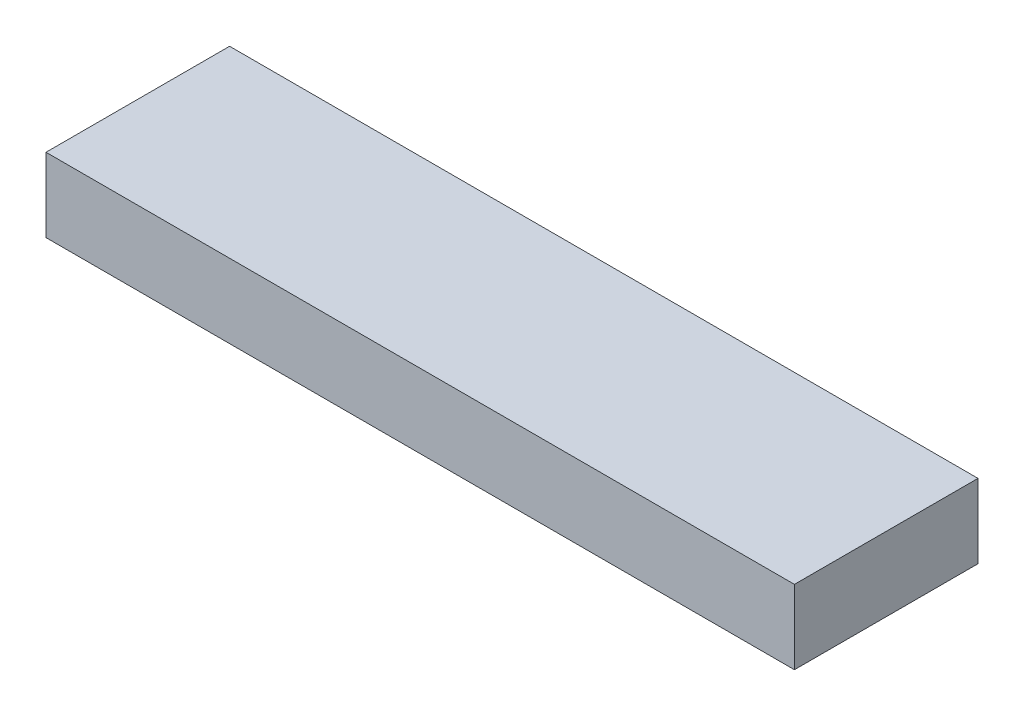
ISO-10303-21;
HEADER;
FILE_DESCRIPTION(('STEP AP214'),'2;1');
FILE_NAME('part.step','',(''),(''),'','','');
FILE_SCHEMA(('AUTOMOTIVE_DESIGN { 1 0 10303 214 1 1 1 1 }'));
ENDSEC;
DATA;
#1=APPLICATION_CONTEXT('core data for automotive mechanical design processes');
#2=APPLICATION_PROTOCOL_DEFINITION('international standard','automotive_design',2000,#1);
#3=PRODUCT_CONTEXT('',#1,'mechanical');
#4=PRODUCT('Part','Part','',(#3));
#5=PRODUCT_RELATED_PRODUCT_CATEGORY('part','',(#4));
#6=PRODUCT_DEFINITION_FORMATION('','',#4);
#7=PRODUCT_DEFINITION_CONTEXT('part definition',#1,'design');
#8=PRODUCT_DEFINITION('design','',#6,#7);
#9=PRODUCT_DEFINITION_SHAPE('','',#8);
#10=(LENGTH_UNIT() NAMED_UNIT(*) SI_UNIT(.MILLI.,.METRE.));
#11=(NAMED_UNIT(*) PLANE_ANGLE_UNIT() SI_UNIT($,.RADIAN.));
#12=(NAMED_UNIT(*) SI_UNIT($,.STERADIAN.) SOLID_ANGLE_UNIT());
#13=UNCERTAINTY_MEASURE_WITH_UNIT(LENGTH_MEASURE(1.E-05),#10,'distance_accuracy_value','');
#14=(GEOMETRIC_REPRESENTATION_CONTEXT(3) GLOBAL_UNCERTAINTY_ASSIGNED_CONTEXT((#13)) GLOBAL_UNIT_ASSIGNED_CONTEXT((#10,
#11,#12)) REPRESENTATION_CONTEXT('',''));
#15=CARTESIAN_POINT('',(0.,0.,0.));
#16=DIRECTION('',(0.,0.,1.));
#17=DIRECTION('',(1.,0.,0.));
#18=AXIS2_PLACEMENT_3D('',#15,#16,#17);
#19=CARTESIAN_POINT('',(15.94,-3.15,-3.91));
#20=DIRECTION('',(1.,0.,0.));
#21=DIRECTION('',(0.,0.,-1.));
#22=AXIS2_PLACEMENT_3D('',#19,#20,#21);
#23=PLANE('',#22);
#24=DIRECTION('',(0.,0.,-1.));
#25=VECTOR('',#24,1.);
#26=CARTESIAN_POINT('',(15.94,0.,-3.91));
#27=LINE('',#26,#25);
#28=CARTESIAN_POINT('',(15.94,0.,3.91));
#29=VERTEX_POINT('',#28);
#30=CARTESIAN_POINT('',(15.94,0.,-3.91));
#31=VERTEX_POINT('',#30);
#32=EDGE_CURVE('E117',#29,#31,#27,.T.);
#33=ORIENTED_EDGE('',*,*,#32,.F.);
#34=DIRECTION('',(0.,1.,0.));
#35=VECTOR('',#34,1.);
#36=CARTESIAN_POINT('',(15.94,-3.15,3.91));
#37=LINE('',#36,#35);
#38=CARTESIAN_POINT('',(15.94,-3.15,3.91));
#39=VERTEX_POINT('',#38);
#40=EDGE_CURVE('E57',#39,#29,#37,.T.);
#41=ORIENTED_EDGE('',*,*,#40,.F.);
#42=DIRECTION('',(0.,0.,-1.));
#43=VECTOR('',#42,1.);
#44=CARTESIAN_POINT('',(15.94,-3.15,-3.91));
#45=LINE('',#44,#43);
#46=CARTESIAN_POINT('',(15.94,-3.15,-3.91));
#47=VERTEX_POINT('',#46);
#48=EDGE_CURVE('E149',#39,#47,#45,.T.);
#49=ORIENTED_EDGE('',*,*,#48,.T.);
#50=DIRECTION('',(0.,1.,0.));
#51=VECTOR('',#50,1.);
#52=CARTESIAN_POINT('',(15.94,-3.15,-3.91));
#53=LINE('',#52,#51);
#54=EDGE_CURVE('E83',#47,#31,#53,.T.);
#55=ORIENTED_EDGE('',*,*,#54,.T.);
#56=EDGE_LOOP('',(#33,#41,#49,#55));
#57=FACE_BOUND('',#56,.T.);
#58=ADVANCED_FACE('F34',(#57),#23,.T.);
#59=CARTESIAN_POINT('',(-15.94,-3.15,3.91));
#60=DIRECTION('',(0.,0.,1.));
#61=DIRECTION('',(1.,0.,0.));
#62=AXIS2_PLACEMENT_3D('',#59,#60,#61);
#63=PLANE('',#62);
#64=DIRECTION('',(1.,0.,0.));
#65=VECTOR('',#64,1.);
#66=CARTESIAN_POINT('',(-15.94,0.,3.91));
#67=LINE('',#66,#65);
#68=CARTESIAN_POINT('',(-15.94,0.,3.91));
#69=VERTEX_POINT('',#68);
#70=EDGE_CURVE('E152',#69,#29,#67,.T.);
#71=ORIENTED_EDGE('',*,*,#70,.F.);
#72=DIRECTION('',(0.,1.,0.));
#73=VECTOR('',#72,1.);
#74=CARTESIAN_POINT('',(-15.94,-3.15,3.91));
#75=LINE('',#74,#73);
#76=CARTESIAN_POINT('',(-15.94,-3.15,3.91));
#77=VERTEX_POINT('',#76);
#78=EDGE_CURVE('E171',#77,#69,#75,.T.);
#79=ORIENTED_EDGE('',*,*,#78,.F.);
#80=DIRECTION('',(1.,0.,0.));
#81=VECTOR('',#80,1.);
#82=CARTESIAN_POINT('',(-15.94,-3.15,3.91));
#83=LINE('',#82,#81);
#84=EDGE_CURVE('E157',#77,#39,#83,.T.);
#85=ORIENTED_EDGE('',*,*,#84,.T.);
#86=ORIENTED_EDGE('',*,*,#40,.T.);
#87=EDGE_LOOP('',(#71,#79,#85,#86));
#88=FACE_BOUND('',#87,.T.);
#89=ADVANCED_FACE('F205',(#88),#63,.T.);
#90=CARTESIAN_POINT('',(-15.94,-3.15,-3.91));
#91=DIRECTION('',(-1.,0.,0.));
#92=DIRECTION('',(0.,0.,1.));
#93=AXIS2_PLACEMENT_3D('',#90,#91,#92);
#94=PLANE('',#93);
#95=DIRECTION('',(0.,0.,1.));
#96=VECTOR('',#95,1.);
#97=CARTESIAN_POINT('',(-15.94,0.,-3.91));
#98=LINE('',#97,#96);
#99=CARTESIAN_POINT('',(-15.94,0.,-3.91));
#100=VERTEX_POINT('',#99);
#101=EDGE_CURVE('E164',#100,#69,#98,.T.);
#102=ORIENTED_EDGE('',*,*,#101,.F.);
#103=DIRECTION('',(0.,1.,0.));
#104=VECTOR('',#103,1.);
#105=CARTESIAN_POINT('',(-15.94,-3.15,-3.91));
#106=LINE('',#105,#104);
#107=CARTESIAN_POINT('',(-15.94,-3.15,-3.91));
#108=VERTEX_POINT('',#107);
#109=EDGE_CURVE('E173',#108,#100,#106,.T.);
#110=ORIENTED_EDGE('',*,*,#109,.F.);
#111=DIRECTION('',(0.,0.,1.));
#112=VECTOR('',#111,1.);
#113=CARTESIAN_POINT('',(-15.94,-3.15,-3.91));
#114=LINE('',#113,#112);
#115=EDGE_CURVE('E154',#108,#77,#114,.T.);
#116=ORIENTED_EDGE('',*,*,#115,.T.);
#117=ORIENTED_EDGE('',*,*,#78,.T.);
#118=EDGE_LOOP('',(#102,#110,#116,#117));
#119=FACE_BOUND('',#118,.T.);
#120=ADVANCED_FACE('F209',(#119),#94,.T.);
#121=CARTESIAN_POINT('',(-15.94,-3.15,-3.91));
#122=DIRECTION('',(0.,0.,-1.));
#123=DIRECTION('',(-1.,0.,0.));
#124=AXIS2_PLACEMENT_3D('',#121,#122,#123);
#125=PLANE('',#124);
#126=DIRECTION('',(-1.,0.,0.));
#127=VECTOR('',#126,1.);
#128=CARTESIAN_POINT('',(-15.94,0.,-3.91));
#129=LINE('',#128,#127);
#130=EDGE_CURVE('E161',#31,#100,#129,.T.);
#131=ORIENTED_EDGE('',*,*,#130,.F.);
#132=ORIENTED_EDGE('',*,*,#54,.F.);
#133=DIRECTION('',(-1.,0.,0.));
#134=VECTOR('',#133,1.);
#135=CARTESIAN_POINT('',(-15.94,-3.15,-3.91));
#136=LINE('',#135,#134);
#137=EDGE_CURVE('E151',#47,#108,#136,.T.);
#138=ORIENTED_EDGE('',*,*,#137,.T.);
#139=ORIENTED_EDGE('',*,*,#109,.T.);
#140=EDGE_LOOP('',(#131,#132,#138,#139));
#141=FACE_BOUND('',#140,.T.);
#142=ADVANCED_FACE('F219',(#141),#125,.T.);
#143=CARTESIAN_POINT('',(0.,-3.15,0.));
#144=DIRECTION('',(0.,1.,0.));
#145=DIRECTION('',(0.,0.,1.));
#146=AXIS2_PLACEMENT_3D('',#143,#144,#145);
#147=PLANE('',#146);
#148=DIRECTION('',(1.,0.,0.));
#149=VECTOR('',#148,1.);
#150=CARTESIAN_POINT('',(0.,-3.15,2.31));
#151=LINE('',#150,#149);
#152=CARTESIAN_POINT('',(-14.34,-3.15,2.31));
#153=VERTEX_POINT('',#152);
#154=CARTESIAN_POINT('',(14.34,-3.15,2.31));
#155=VERTEX_POINT('',#154);
#156=EDGE_CURVE('E144',#153,#155,#151,.T.);
#157=ORIENTED_EDGE('',*,*,#156,.T.);
#158=DIRECTION('',(0.,0.,-1.));
#159=VECTOR('',#158,1.);
#160=CARTESIAN_POINT('',(14.34,-3.15,0.));
#161=LINE('',#160,#159);
#162=CARTESIAN_POINT('',(14.34,-3.15,-2.31));
#163=VERTEX_POINT('',#162);
#164=EDGE_CURVE('E112',#155,#163,#161,.T.);
#165=ORIENTED_EDGE('',*,*,#164,.T.);
#166=DIRECTION('',(-1.,0.,0.));
#167=VECTOR('',#166,1.);
#168=CARTESIAN_POINT('',(0.,-3.15,-2.31));
#169=LINE('',#168,#167);
#170=CARTESIAN_POINT('',(-14.34,-3.15,-2.31));
#171=VERTEX_POINT('',#170);
#172=EDGE_CURVE('E134',#163,#171,#169,.T.);
#173=ORIENTED_EDGE('',*,*,#172,.T.);
#174=DIRECTION('',(0.,0.,1.));
#175=VECTOR('',#174,1.);
#176=CARTESIAN_POINT('',(-14.34,-3.15,0.));
#177=LINE('',#176,#175);
#178=EDGE_CURVE('E48',#171,#153,#177,.T.);
#179=ORIENTED_EDGE('',*,*,#178,.T.);
#180=EDGE_LOOP('',(#157,#165,#173,#179));
#181=FACE_BOUND('',#180,.T.);
#182=ORIENTED_EDGE('',*,*,#48,.F.);
#183=ORIENTED_EDGE('',*,*,#84,.F.);
#184=ORIENTED_EDGE('',*,*,#115,.F.);
#185=ORIENTED_EDGE('',*,*,#137,.F.);
#186=EDGE_LOOP('',(#182,#183,#184,#185));
#187=FACE_BOUND('',#186,.T.);
#188=ADVANCED_FACE('F218',(#181,#187),#147,.F.);
#189=CARTESIAN_POINT('',(0.,0.,0.));
#190=DIRECTION('',(0.,1.,0.));
#191=DIRECTION('',(0.,0.,1.));
#192=AXIS2_PLACEMENT_3D('',#189,#190,#191);
#193=PLANE('',#192);
#194=ORIENTED_EDGE('',*,*,#32,.T.);
#195=ORIENTED_EDGE('',*,*,#130,.T.);
#196=ORIENTED_EDGE('',*,*,#101,.T.);
#197=ORIENTED_EDGE('',*,*,#70,.T.);
#198=EDGE_LOOP('',(#194,#195,#196,#197));
#199=FACE_BOUND('',#198,.T.);
#200=ADVANCED_FACE('F212',(#199),#193,.T.);
#201=CARTESIAN_POINT('',(14.34,-3.15,-3.91));
#202=DIRECTION('',(1.,0.,0.));
#203=DIRECTION('',(0.,0.,-1.));
#204=AXIS2_PLACEMENT_3D('',#201,#202,#203);
#205=PLANE('',#204);
#206=DIRECTION('',(0.,0.,-1.));
#207=VECTOR('',#206,1.);
#208=CARTESIAN_POINT('',(14.34,-1.6,0.));
#209=LINE('',#208,#207);
#210=CARTESIAN_POINT('',(14.34,-1.6,2.31));
#211=VERTEX_POINT('',#210);
#212=CARTESIAN_POINT('',(14.34,-1.6,-2.31));
#213=VERTEX_POINT('',#212);
#214=EDGE_CURVE('E110',#211,#213,#209,.T.);
#215=ORIENTED_EDGE('',*,*,#214,.T.);
#216=DIRECTION('',(0.,1.,0.));
#217=VECTOR('',#216,1.);
#218=CARTESIAN_POINT('',(14.34,-3.15,-2.31));
#219=LINE('',#218,#217);
#220=EDGE_CURVE('E139',#163,#213,#219,.T.);
#221=ORIENTED_EDGE('',*,*,#220,.F.);
#222=ORIENTED_EDGE('',*,*,#164,.F.);
#223=DIRECTION('',(0.,1.,0.));
#224=VECTOR('',#223,1.);
#225=CARTESIAN_POINT('',(14.34,-3.15,2.31));
#226=LINE('',#225,#224);
#227=EDGE_CURVE('E107',#155,#211,#226,.T.);
#228=ORIENTED_EDGE('',*,*,#227,.T.);
#229=EDGE_LOOP('',(#215,#221,#222,#228));
#230=FACE_BOUND('',#229,.T.);
#231=ADVANCED_FACE('F109',(#230),#205,.F.);
#232=CARTESIAN_POINT('',(-15.94,-3.15,2.31));
#233=DIRECTION('',(0.,0.,1.));
#234=DIRECTION('',(1.,0.,0.));
#235=AXIS2_PLACEMENT_3D('',#232,#233,#234);
#236=PLANE('',#235);
#237=DIRECTION('',(1.,0.,0.));
#238=VECTOR('',#237,1.);
#239=CARTESIAN_POINT('',(0.,-1.6,2.31));
#240=LINE('',#239,#238);
#241=CARTESIAN_POINT('',(-14.34,-1.6,2.31));
#242=VERTEX_POINT('',#241);
#243=EDGE_CURVE('E125',#242,#211,#240,.T.);
#244=ORIENTED_EDGE('',*,*,#243,.T.);
#245=ORIENTED_EDGE('',*,*,#227,.F.);
#246=ORIENTED_EDGE('',*,*,#156,.F.);
#247=DIRECTION('',(0.,1.,0.));
#248=VECTOR('',#247,1.);
#249=CARTESIAN_POINT('',(-14.34,-3.15,2.31));
#250=LINE('',#249,#248);
#251=EDGE_CURVE('E118',#153,#242,#250,.T.);
#252=ORIENTED_EDGE('',*,*,#251,.T.);
#253=EDGE_LOOP('',(#244,#245,#246,#252));
#254=FACE_BOUND('',#253,.T.);
#255=ADVANCED_FACE('F130',(#254),#236,.F.);
#256=CARTESIAN_POINT('',(-14.34,-3.15,-3.91));
#257=DIRECTION('',(-1.,0.,0.));
#258=DIRECTION('',(0.,0.,1.));
#259=AXIS2_PLACEMENT_3D('',#256,#257,#258);
#260=PLANE('',#259);
#261=DIRECTION('',(0.,0.,1.));
#262=VECTOR('',#261,1.);
#263=CARTESIAN_POINT('',(-14.34,-1.6,0.));
#264=LINE('',#263,#262);
#265=CARTESIAN_POINT('',(-14.34,-1.6,-2.31));
#266=VERTEX_POINT('',#265);
#267=EDGE_CURVE('E132',#266,#242,#264,.T.);
#268=ORIENTED_EDGE('',*,*,#267,.T.);
#269=ORIENTED_EDGE('',*,*,#251,.F.);
#270=ORIENTED_EDGE('',*,*,#178,.F.);
#271=DIRECTION('',(0.,1.,0.));
#272=VECTOR('',#271,1.);
#273=CARTESIAN_POINT('',(-14.34,-3.15,-2.31));
#274=LINE('',#273,#272);
#275=EDGE_CURVE('E140',#171,#266,#274,.T.);
#276=ORIENTED_EDGE('',*,*,#275,.T.);
#277=EDGE_LOOP('',(#268,#269,#270,#276));
#278=FACE_BOUND('',#277,.T.);
#279=ADVANCED_FACE('F233',(#278),#260,.F.);
#280=CARTESIAN_POINT('',(-15.94,-3.15,-2.31));
#281=DIRECTION('',(0.,0.,-1.));
#282=DIRECTION('',(-1.,0.,0.));
#283=AXIS2_PLACEMENT_3D('',#280,#281,#282);
#284=PLANE('',#283);
#285=DIRECTION('',(-1.,0.,0.));
#286=VECTOR('',#285,1.);
#287=CARTESIAN_POINT('',(0.,-1.6,-2.31));
#288=LINE('',#287,#286);
#289=EDGE_CURVE('E127',#213,#266,#288,.T.);
#290=ORIENTED_EDGE('',*,*,#289,.T.);
#291=ORIENTED_EDGE('',*,*,#275,.F.);
#292=ORIENTED_EDGE('',*,*,#172,.F.);
#293=ORIENTED_EDGE('',*,*,#220,.T.);
#294=EDGE_LOOP('',(#290,#291,#292,#293));
#295=FACE_BOUND('',#294,.T.);
#296=ADVANCED_FACE('F185',(#295),#284,.F.);
#297=CARTESIAN_POINT('',(0.,-1.6,0.));
#298=DIRECTION('',(0.,1.,0.));
#299=DIRECTION('',(0.,0.,1.));
#300=AXIS2_PLACEMENT_3D('',#297,#298,#299);
#301=PLANE('',#300);
#302=CARTESIAN_POINT('',(7.97,-1.6,0.));
#303=DIRECTION('',(0.,1.,0.));
#304=DIRECTION('',(0.,0.,1.));
#305=AXIS2_PLACEMENT_3D('',#302,#303,#304);
#306=CIRCLE('',#305,1.475);
#307=CARTESIAN_POINT('',(7.97,-1.6,1.475));
#308=VERTEX_POINT('',#307);
#309=EDGE_CURVE('E12',#308,#308,#306,.F.);
#310=ORIENTED_EDGE('',*,*,#309,.F.);
#311=EDGE_LOOP('',(#310));
#312=FACE_BOUND('',#311,.T.);
#313=CARTESIAN_POINT('',(0.,-1.6,0.));
#314=DIRECTION('',(0.,1.,0.));
#315=DIRECTION('',(0.,0.,1.));
#316=AXIS2_PLACEMENT_3D('',#313,#314,#315);
#317=CIRCLE('',#316,1.475);
#318=CARTESIAN_POINT('',(0.,-1.6,1.475));
#319=VERTEX_POINT('',#318);
#320=EDGE_CURVE('E41',#319,#319,#317,.F.);
#321=ORIENTED_EDGE('',*,*,#320,.F.);
#322=EDGE_LOOP('',(#321));
#323=FACE_BOUND('',#322,.T.);
#324=CARTESIAN_POINT('',(-7.97,-1.6,0.));
#325=DIRECTION('',(0.,1.,0.));
#326=DIRECTION('',(0.,0.,1.));
#327=AXIS2_PLACEMENT_3D('',#324,#325,#326);
#328=CIRCLE('',#327,1.475);
#329=CARTESIAN_POINT('',(-7.97,-1.6,1.475));
#330=VERTEX_POINT('',#329);
#331=EDGE_CURVE('E170',#330,#330,#328,.F.);
#332=ORIENTED_EDGE('',*,*,#331,.F.);
#333=EDGE_LOOP('',(#332));
#334=FACE_BOUND('',#333,.T.);
#335=ORIENTED_EDGE('',*,*,#214,.F.);
#336=ORIENTED_EDGE('',*,*,#243,.F.);
#337=ORIENTED_EDGE('',*,*,#267,.F.);
#338=ORIENTED_EDGE('',*,*,#289,.F.);
#339=EDGE_LOOP('',(#335,#336,#337,#338));
#340=FACE_BOUND('',#339,.T.);
#341=ADVANCED_FACE('F123',(#312,#323,#334,#340),#301,.F.);
#342=CARTESIAN_POINT('',(-7.97,-7.32193000900063,0.));
#343=DIRECTION('',(0.,1.,0.));
#344=DIRECTION('',(0.,0.,1.));
#345=AXIS2_PLACEMENT_3D('',#342,#343,#344);
#346=CYLINDRICAL_SURFACE('',#345,1.475);
#347=CARTESIAN_POINT('',(-7.97,-2.95,0.));
#348=DIRECTION('',(0.,1.,0.));
#349=DIRECTION('',(0.,0.,1.));
#350=AXIS2_PLACEMENT_3D('',#347,#348,#349);
#351=CIRCLE('',#350,1.475);
#352=CARTESIAN_POINT('',(-7.97,-2.95,1.475));
#353=VERTEX_POINT('',#352);
#354=EDGE_CURVE('E252',#353,#353,#351,.T.);
#355=ORIENTED_EDGE('',*,*,#354,.T.);
#356=EDGE_LOOP('',(#355));
#357=FACE_BOUND('',#356,.T.);
#358=ORIENTED_EDGE('',*,*,#331,.T.);
#359=EDGE_LOOP('',(#358));
#360=FACE_BOUND('',#359,.T.);
#361=ADVANCED_FACE('F184',(#357,#360),#346,.T.);
#362=CARTESIAN_POINT('',(-7.97,-7.32193000900063,0.));
#363=DIRECTION('',(0.,1.,0.));
#364=DIRECTION('',(0.,0.,1.));
#365=AXIS2_PLACEMENT_3D('',#362,#363,#364);
#366=CYLINDRICAL_SURFACE('',#365,0.7);
#367=CARTESIAN_POINT('',(-7.97,-2.95,0.));
#368=DIRECTION('',(0.,1.,0.));
#369=DIRECTION('',(0.,0.,1.));
#370=AXIS2_PLACEMENT_3D('',#367,#368,#369);
#371=CIRCLE('',#370,0.7);
#372=CARTESIAN_POINT('',(-7.97,-2.95,0.7));
#373=VERTEX_POINT('',#372);
#374=EDGE_CURVE('E128',#373,#373,#371,.T.);
#375=ORIENTED_EDGE('',*,*,#374,.F.);
#376=EDGE_LOOP('',(#375));
#377=FACE_BOUND('',#376,.T.);
#378=CARTESIAN_POINT('',(-7.97,-1.6,0.));
#379=DIRECTION('',(0.,-1.,0.));
#380=DIRECTION('',(0.,0.,-1.));
#381=AXIS2_PLACEMENT_3D('',#378,#379,#380);
#382=CIRCLE('',#381,0.7);
#383=CARTESIAN_POINT('',(-7.97,-1.6,-0.7));
#384=VERTEX_POINT('',#383);
#385=EDGE_CURVE('E253',#384,#384,#382,.T.);
#386=ORIENTED_EDGE('',*,*,#385,.F.);
#387=EDGE_LOOP('',(#386));
#388=FACE_BOUND('',#387,.T.);
#389=ADVANCED_FACE('F193',(#377,#388),#366,.F.);
#390=CARTESIAN_POINT('',(0.,-2.95,0.));
#391=DIRECTION('',(0.,1.,0.));
#392=DIRECTION('',(0.,0.,1.));
#393=AXIS2_PLACEMENT_3D('',#390,#391,#392);
#394=PLANE('',#393);
#395=ORIENTED_EDGE('',*,*,#374,.T.);
#396=EDGE_LOOP('',(#395));
#397=FACE_BOUND('',#396,.T.);
#398=ORIENTED_EDGE('',*,*,#354,.F.);
#399=EDGE_LOOP('',(#398));
#400=FACE_BOUND('',#399,.T.);
#401=ADVANCED_FACE('F199',(#397,#400),#394,.F.);
#402=ORIENTED_EDGE('',*,*,#385,.T.);
#403=EDGE_LOOP('',(#402));
#404=FACE_BOUND('',#403,.T.);
#405=ADVANCED_FACE('F189',(#404),#301,.F.);
#406=CARTESIAN_POINT('',(0.,-7.32193000900063,0.));
#407=DIRECTION('',(0.,1.,0.));
#408=DIRECTION('',(0.,0.,1.));
#409=AXIS2_PLACEMENT_3D('',#406,#407,#408);
#410=CYLINDRICAL_SURFACE('',#409,1.475);
#411=CARTESIAN_POINT('',(0.,-2.95,0.));
#412=DIRECTION('',(0.,1.,0.));
#413=DIRECTION('',(0.,0.,1.));
#414=AXIS2_PLACEMENT_3D('',#411,#412,#413);
#415=CIRCLE('',#414,1.475);
#416=CARTESIAN_POINT('',(0.,-2.95,1.475));
#417=VERTEX_POINT('',#416);
#418=EDGE_CURVE('E262',#417,#417,#415,.T.);
#419=ORIENTED_EDGE('',*,*,#418,.T.);
#420=EDGE_LOOP('',(#419));
#421=FACE_BOUND('',#420,.T.);
#422=ORIENTED_EDGE('',*,*,#320,.T.);
#423=EDGE_LOOP('',(#422));
#424=FACE_BOUND('',#423,.T.);
#425=ADVANCED_FACE('F180',(#421,#424),#410,.T.);
#426=CARTESIAN_POINT('',(0.,-7.32193000900063,0.));
#427=DIRECTION('',(0.,1.,0.));
#428=DIRECTION('',(0.,0.,1.));
#429=AXIS2_PLACEMENT_3D('',#426,#427,#428);
#430=CYLINDRICAL_SURFACE('',#429,0.7);
#431=CARTESIAN_POINT('',(0.,-2.95,0.));
#432=DIRECTION('',(0.,1.,0.));
#433=DIRECTION('',(0.,0.,1.));
#434=AXIS2_PLACEMENT_3D('',#431,#432,#433);
#435=CIRCLE('',#434,0.7);
#436=CARTESIAN_POINT('',(0.,-2.95,0.7));
#437=VERTEX_POINT('',#436);
#438=EDGE_CURVE('E257',#437,#437,#435,.T.);
#439=ORIENTED_EDGE('',*,*,#438,.F.);
#440=EDGE_LOOP('',(#439));
#441=FACE_BOUND('',#440,.T.);
#442=CARTESIAN_POINT('',(0.,-1.6,0.));
#443=DIRECTION('',(0.,-1.,0.));
#444=DIRECTION('',(0.,0.,-1.));
#445=AXIS2_PLACEMENT_3D('',#442,#443,#444);
#446=CIRCLE('',#445,0.7);
#447=CARTESIAN_POINT('',(0.,-1.6,-0.7));
#448=VERTEX_POINT('',#447);
#449=EDGE_CURVE('E265',#448,#448,#446,.T.);
#450=ORIENTED_EDGE('',*,*,#449,.F.);
#451=EDGE_LOOP('',(#450));
#452=FACE_BOUND('',#451,.T.);
#453=ADVANCED_FACE('F297',(#441,#452),#430,.F.);
#454=CARTESIAN_POINT('',(0.,-2.95,0.));
#455=DIRECTION('',(0.,1.,0.));
#456=DIRECTION('',(0.,0.,1.));
#457=AXIS2_PLACEMENT_3D('',#454,#455,#456);
#458=PLANE('',#457);
#459=ORIENTED_EDGE('',*,*,#438,.T.);
#460=EDGE_LOOP('',(#459));
#461=FACE_BOUND('',#460,.T.);
#462=ORIENTED_EDGE('',*,*,#418,.F.);
#463=EDGE_LOOP('',(#462));
#464=FACE_BOUND('',#463,.T.);
#465=ADVANCED_FACE('F300',(#461,#464),#458,.F.);
#466=ORIENTED_EDGE('',*,*,#449,.T.);
#467=EDGE_LOOP('',(#466));
#468=FACE_BOUND('',#467,.T.);
#469=ADVANCED_FACE('F247',(#468),#301,.F.);
#470=CARTESIAN_POINT('',(7.97,-7.32193000900063,0.));
#471=DIRECTION('',(0.,1.,0.));
#472=DIRECTION('',(0.,0.,1.));
#473=AXIS2_PLACEMENT_3D('',#470,#471,#472);
#474=CYLINDRICAL_SURFACE('',#473,1.475);
#475=CARTESIAN_POINT('',(7.97,-2.95,0.));
#476=DIRECTION('',(0.,1.,0.));
#477=DIRECTION('',(0.,0.,1.));
#478=AXIS2_PLACEMENT_3D('',#475,#476,#477);
#479=CIRCLE('',#478,1.475);
#480=CARTESIAN_POINT('',(7.97,-2.95,1.475));
#481=VERTEX_POINT('',#480);
#482=EDGE_CURVE('E271',#481,#481,#479,.T.);
#483=ORIENTED_EDGE('',*,*,#482,.T.);
#484=EDGE_LOOP('',(#483));
#485=FACE_BOUND('',#484,.T.);
#486=ORIENTED_EDGE('',*,*,#309,.T.);
#487=EDGE_LOOP('',(#486));
#488=FACE_BOUND('',#487,.T.);
#489=ADVANCED_FACE('F282',(#485,#488),#474,.T.);
#490=CARTESIAN_POINT('',(7.97,-7.32193000900063,0.));
#491=DIRECTION('',(0.,1.,0.));
#492=DIRECTION('',(0.,0.,1.));
#493=AXIS2_PLACEMENT_3D('',#490,#491,#492);
#494=CYLINDRICAL_SURFACE('',#493,0.700000000000001);
#495=CARTESIAN_POINT('',(7.97,-2.95,0.));
#496=DIRECTION('',(0.,1.,0.));
#497=DIRECTION('',(0.,0.,1.));
#498=AXIS2_PLACEMENT_3D('',#495,#496,#497);
#499=CIRCLE('',#498,0.700000000000001);
#500=CARTESIAN_POINT('',(7.97,-2.95,0.700000000000001));
#501=VERTEX_POINT('',#500);
#502=EDGE_CURVE('E268',#501,#501,#499,.T.);
#503=ORIENTED_EDGE('',*,*,#502,.F.);
#504=EDGE_LOOP('',(#503));
#505=FACE_BOUND('',#504,.T.);
#506=CARTESIAN_POINT('',(7.97,-1.6,0.));
#507=DIRECTION('',(0.,-1.,0.));
#508=DIRECTION('',(0.,0.,-1.));
#509=AXIS2_PLACEMENT_3D('',#506,#507,#508);
#510=CIRCLE('',#509,0.700000000000001);
#511=CARTESIAN_POINT('',(7.97,-1.6,-0.700000000000001));
#512=VERTEX_POINT('',#511);
#513=EDGE_CURVE('E274',#512,#512,#510,.T.);
#514=ORIENTED_EDGE('',*,*,#513,.F.);
#515=EDGE_LOOP('',(#514));
#516=FACE_BOUND('',#515,.T.);
#517=ADVANCED_FACE('F279',(#505,#516),#494,.F.);
#518=CARTESIAN_POINT('',(0.,-2.95,0.));
#519=DIRECTION('',(0.,1.,0.));
#520=DIRECTION('',(0.,0.,1.));
#521=AXIS2_PLACEMENT_3D('',#518,#519,#520);
#522=PLANE('',#521);
#523=ORIENTED_EDGE('',*,*,#502,.T.);
#524=EDGE_LOOP('',(#523));
#525=FACE_BOUND('',#524,.T.);
#526=ORIENTED_EDGE('',*,*,#482,.F.);
#527=EDGE_LOOP('',(#526));
#528=FACE_BOUND('',#527,.T.);
#529=ADVANCED_FACE('F281',(#525,#528),#522,.F.);
#530=ORIENTED_EDGE('',*,*,#513,.T.);
#531=EDGE_LOOP('',(#530));
#532=FACE_BOUND('',#531,.T.);
#533=ADVANCED_FACE('F188',(#532),#301,.F.);
#534=CLOSED_SHELL('',(#58,#89,#120,#142,#188,#200,#231,#255,#279,#296,#341,#361,#389,#401,#405,
#425,#453,#465,#469,#489,#517,#529,#533));
#535=MANIFOLD_SOLID_BREP('B2',#534);
#536=ADVANCED_BREP_SHAPE_REPRESENTATION('',(#18,#535),#14);
#537=SHAPE_DEFINITION_REPRESENTATION(#9,#536);
ENDSEC;
END-ISO-10303-21;
